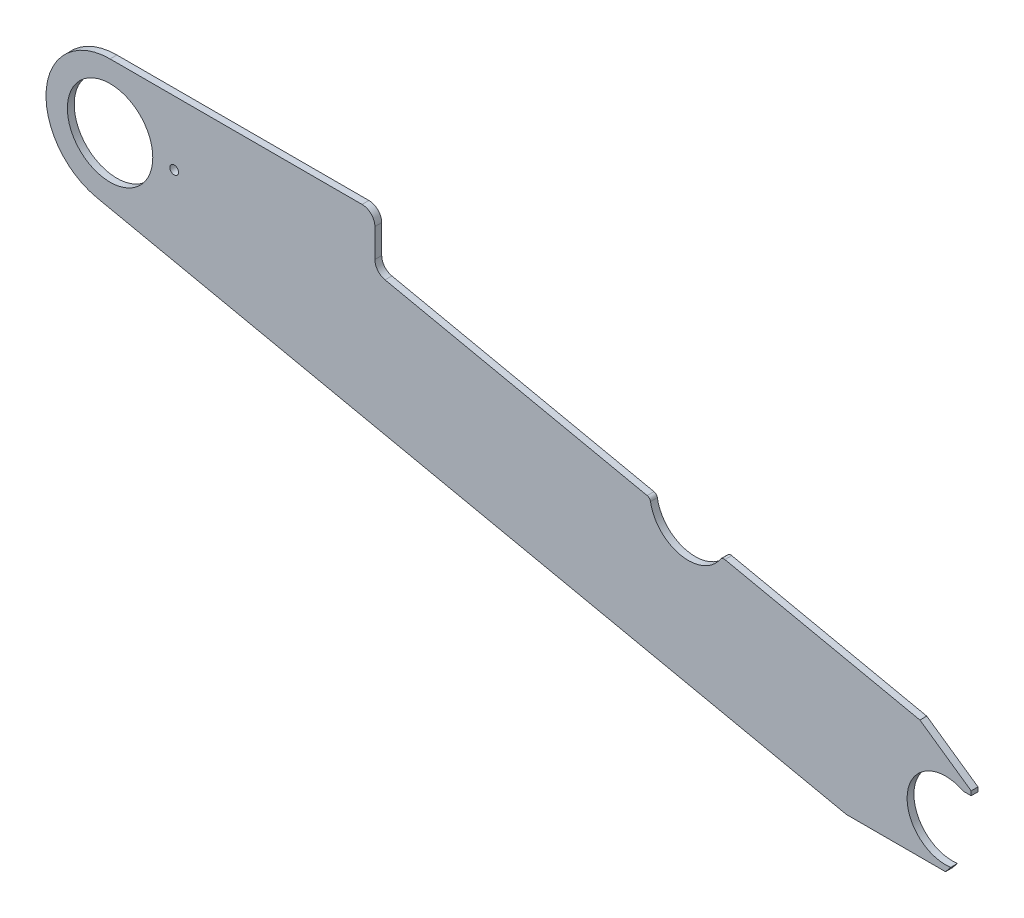
ISO-10303-21;
HEADER;
FILE_DESCRIPTION(('STEP AP214'),'2;1');
FILE_NAME('part.step','',(''),(''),'','','');
FILE_SCHEMA(('AUTOMOTIVE_DESIGN { 1 0 10303 214 1 1 1 1 }'));
ENDSEC;
DATA;
#1=APPLICATION_CONTEXT('core data for automotive mechanical design processes');
#2=APPLICATION_PROTOCOL_DEFINITION('international standard','automotive_design',2000,#1);
#3=PRODUCT_CONTEXT('',#1,'mechanical');
#4=PRODUCT('Part','Part','',(#3));
#5=PRODUCT_RELATED_PRODUCT_CATEGORY('part','',(#4));
#6=PRODUCT_DEFINITION_FORMATION('','',#4);
#7=PRODUCT_DEFINITION_CONTEXT('part definition',#1,'design');
#8=PRODUCT_DEFINITION('design','',#6,#7);
#9=PRODUCT_DEFINITION_SHAPE('','',#8);
#10=(LENGTH_UNIT() NAMED_UNIT(*) SI_UNIT(.MILLI.,.METRE.));
#11=(NAMED_UNIT(*) PLANE_ANGLE_UNIT() SI_UNIT($,.RADIAN.));
#12=(NAMED_UNIT(*) SI_UNIT($,.STERADIAN.) SOLID_ANGLE_UNIT());
#13=UNCERTAINTY_MEASURE_WITH_UNIT(LENGTH_MEASURE(1.E-05),#10,'distance_accuracy_value','');
#14=(GEOMETRIC_REPRESENTATION_CONTEXT(3) GLOBAL_UNCERTAINTY_ASSIGNED_CONTEXT((#13)) GLOBAL_UNIT_ASSIGNED_CONTEXT((#10,
#11,#12)) REPRESENTATION_CONTEXT('',''));
#15=CARTESIAN_POINT('',(0.,0.,0.));
#16=DIRECTION('',(0.,0.,1.));
#17=DIRECTION('',(1.,0.,0.));
#18=AXIS2_PLACEMENT_3D('',#15,#16,#17);
#19=CARTESIAN_POINT('',(977.999999999997,-208.000000000002,7.99999999999801));
#20=DIRECTION('',(0.,0.,1.00000000000001));
#21=DIRECTION('',(1.,0.,0.));
#22=AXIS2_PLACEMENT_3D('',#19,#20,#21);
#23=PLANE('',#22);
#24=CARTESIAN_POINT('',(75.0000000000002,0.,8.00000000000001));
#25=DIRECTION('',(0.,0.,1.00000000000001));
#26=DIRECTION('',(1.,0.,0.));
#27=AXIS2_PLACEMENT_3D('',#24,#25,#26);
#28=CIRCLE('',#27,5.09999999999999);
#29=CARTESIAN_POINT('',(80.1000000000002,0.,8.00000000000001));
#30=VERTEX_POINT('',#29);
#31=EDGE_CURVE('E314',#30,#30,#28,.T.);
#32=ORIENTED_EDGE('',*,*,#31,.F.);
#33=EDGE_LOOP('',(#32));
#34=FACE_BOUND('',#33,.T.);
#35=DIRECTION('',(-0.978123251294984,0.208026212954354,0.));
#36=VECTOR('',#35,1.);
#37=CARTESIAN_POINT('',(716.293570547808,-71.9320613168134,8.00000000000001));
#38=LINE('',#37,#36);
#39=CARTESIAN_POINT('',(947.999999999998,-121.211138337323,8.00000000000001));
#40=VERTEX_POINT('',#39);
#41=CARTESIAN_POINT('',(719.758987727906,-72.6690825575704,8.00000000000001));
#42=VERTEX_POINT('',#41);
#43=EDGE_CURVE('E220',#40,#42,#38,.T.);
#44=ORIENTED_EDGE('',*,*,#43,.T.);
#45=CARTESIAN_POINT('',(718.718856663133,-77.5596988140473,7.99999999999829));
#46=DIRECTION('',(0.,0.,1.00000000000001));
#47=DIRECTION('',(1.,0.,0.));
#48=AXIS2_PLACEMENT_3D('',#45,#46,#47);
#49=CIRCLE('',#48,5.);
#50=CARTESIAN_POINT('',(714.54697099682,-74.8037289326409,8.00000000000001));
#51=VERTEX_POINT('',#50);
#52=EDGE_CURVE('E44',#42,#51,#49,.T.);
#53=ORIENTED_EDGE('',*,*,#52,.T.);
#54=CARTESIAN_POINT('',(677.,-50.0000000000001,8.00000000000001));
#55=DIRECTION('',(0.,0.,-1.00000000000001));
#56=DIRECTION('',(1.,0.,0.));
#57=AXIS2_PLACEMENT_3D('',#54,#55,#56);
#58=CIRCLE('',#57,45.);
#59=CARTESIAN_POINT('',(632.608821060404,-57.3772103367567,8.00000000000001));
#60=VERTEX_POINT('',#59);
#61=EDGE_CURVE('E219',#51,#60,#58,.T.);
#62=ORIENTED_EDGE('',*,*,#61,.T.);
#63=CARTESIAN_POINT('',(627.676467844893,-58.1969003741741,8.00000000000001));
#64=DIRECTION('',(0.,0.,1.00000000000001));
#65=DIRECTION('',(1.,0.,0.));
#66=AXIS2_PLACEMENT_3D('',#63,#64,#65);
#67=CIRCLE('',#66,5.);
#68=CARTESIAN_POINT('',(628.716598909665,-53.3062841176992,7.99999999999995));
#69=VERTEX_POINT('',#68);
#70=EDGE_CURVE('E51',#60,#69,#67,.T.);
#71=ORIENTED_EDGE('',*,*,#70,.T.);
#72=DIRECTION('',(-0.978123251294984,0.208026212954354,0.));
#73=VECTOR('',#72,1.);
#74=CARTESIAN_POINT('',(310.,14.4780232168717,8.00000000000001));
#75=LINE('',#74,#73);
#76=CARTESIAN_POINT('',(321.879606805685,11.9514810741495,8.00000000000001));
#77=VERTEX_POINT('',#76);
#78=EDGE_CURVE('E228',#69,#77,#75,.T.);
#79=ORIENTED_EDGE('',*,*,#78,.T.);
#80=CARTESIAN_POINT('',(325.,26.6233298435742,8.00000000000001));
#81=DIRECTION('',(0.,0.,1.00000000000001));
#82=DIRECTION('',(1.,0.,0.));
#83=AXIS2_PLACEMENT_3D('',#80,#81,#82);
#84=CIRCLE('',#83,15.);
#85=CARTESIAN_POINT('',(310.,26.6233298435742,8.00000000000001));
#86=VERTEX_POINT('',#85);
#87=EDGE_CURVE('E205',#77,#86,#84,.F.);
#88=ORIENTED_EDGE('',*,*,#87,.T.);
#89=DIRECTION('',(0.,1.00000000000001,0.));
#90=VECTOR('',#89,1.);
#91=CARTESIAN_POINT('',(310.,75.0000000000006,8.00000000000001));
#92=LINE('',#91,#90);
#93=CARTESIAN_POINT('',(310.,60.0000000000002,8.00000000000001));
#94=VERTEX_POINT('',#93);
#95=EDGE_CURVE('E299',#86,#94,#92,.T.);
#96=ORIENTED_EDGE('',*,*,#95,.T.);
#97=CARTESIAN_POINT('',(295.,60.0000000000002,8.00000000000001));
#98=DIRECTION('',(0.,0.,1.00000000000001));
#99=DIRECTION('',(1.,0.,0.));
#100=AXIS2_PLACEMENT_3D('',#97,#98,#99);
#101=CIRCLE('',#100,15.);
#102=CARTESIAN_POINT('',(295.,75.0000000000006,8.00000000000001));
#103=VERTEX_POINT('',#102);
#104=EDGE_CURVE('E200',#94,#103,#101,.T.);
#105=ORIENTED_EDGE('',*,*,#104,.T.);
#106=DIRECTION('',(-1.,0.,0.));
#107=VECTOR('',#106,1.);
#108=CARTESIAN_POINT('',(0.,75.0000000000002,8.00000000000001));
#109=LINE('',#108,#107);
#110=CARTESIAN_POINT('',(0.,75.0000000000002,8.00000000000001));
#111=VERTEX_POINT('',#110);
#112=EDGE_CURVE('E297',#103,#111,#109,.T.);
#113=ORIENTED_EDGE('',*,*,#112,.T.);
#114=CARTESIAN_POINT('',(0.,0.,8.00000000000001));
#115=DIRECTION('',(0.,0.,1.00000000000001));
#116=DIRECTION('',(1.,0.,0.));
#117=AXIS2_PLACEMENT_3D('',#114,#115,#116);
#118=CIRCLE('',#117,75.);
#119=CARTESIAN_POINT('',(-15.6019659715763,-73.3592438471241,8.00000000000001));
#120=VERTEX_POINT('',#119);
#121=EDGE_CURVE('E295',#111,#120,#118,.T.);
#122=ORIENTED_EDGE('',*,*,#121,.T.);
#123=DIRECTION('',(0.978123251294984,-0.208026212954354,0.));
#124=VECTOR('',#123,1.);
#125=CARTESIAN_POINT('',(-15.6019659715763,-73.3592438471241,8.00000000000001));
#126=LINE('',#125,#124);
#127=CARTESIAN_POINT('',(861.968512478003,-260.000000000005,7.99999999999995));
#128=VERTEX_POINT('',#127);
#129=EDGE_CURVE('E293',#120,#128,#126,.T.);
#130=ORIENTED_EDGE('',*,*,#129,.T.);
#131=DIRECTION('',(1.,0.,0.));
#132=VECTOR('',#131,1.);
#133=CARTESIAN_POINT('',(977.999999999997,-260.000000000005,7.99999999999995));
#134=LINE('',#133,#132);
#135=CARTESIAN_POINT('',(977.999999999997,-260.000000000005,7.99999999999995));
#136=VERTEX_POINT('',#135);
#137=EDGE_CURVE('E291',#128,#136,#134,.T.);
#138=ORIENTED_EDGE('',*,*,#137,.T.);
#139=DIRECTION('',(0.629709857820889,0.776830415832966,0.));
#140=VECTOR('',#139,1.);
#141=CARTESIAN_POINT('',(977.999999999997,-260.000000000005,7.99999999999995));
#142=LINE('',#141,#140);
#143=CARTESIAN_POINT('',(983.999999999997,-252.59820624196,7.99999999999995));
#144=VERTEX_POINT('',#143);
#145=EDGE_CURVE('E173',#136,#144,#142,.T.);
#146=ORIENTED_EDGE('',*,*,#145,.T.);
#147=CARTESIAN_POINT('',(977.999999999997,-208.000000000002,7.99999999999801));
#148=DIRECTION('',(0.,0.,-1.00000000000001));
#149=DIRECTION('',(1.,0.,0.));
#150=AXIS2_PLACEMENT_3D('',#147,#148,#149);
#151=CIRCLE('',#150,45.);
#152=CARTESIAN_POINT('',(998.615528128088,-168.000000000002,8.00000000000001));
#153=VERTEX_POINT('',#152);
#154=EDGE_CURVE('E168',#144,#153,#151,.T.);
#155=ORIENTED_EDGE('',*,*,#154,.T.);
#156=DIRECTION('',(1.,0.,0.));
#157=VECTOR('',#156,1.);
#158=CARTESIAN_POINT('',(1008.,-168.000000000002,8.00000000000001));
#159=LINE('',#158,#157);
#160=CARTESIAN_POINT('',(1008.,-168.000000000002,8.00000000000001));
#161=VERTEX_POINT('',#160);
#162=EDGE_CURVE('E158',#153,#161,#159,.T.);
#163=ORIENTED_EDGE('',*,*,#162,.T.);
#164=DIRECTION('',(0.,1.00000000000001,0.));
#165=VECTOR('',#164,1.);
#166=CARTESIAN_POINT('',(1008.,-163.000000000002,7.99999999999995));
#167=LINE('',#166,#165);
#168=CARTESIAN_POINT('',(1008.,-163.000000000002,7.99999999999995));
#169=VERTEX_POINT('',#168);
#170=EDGE_CURVE('E167',#161,#169,#167,.T.);
#171=ORIENTED_EDGE('',*,*,#170,.T.);
#172=DIRECTION('',(-0.82058622831256,0.571522739620892,0.));
#173=VECTOR('',#172,1.);
#174=CARTESIAN_POINT('',(947.999999999998,-121.211138337323,8.00000000000001));
#175=LINE('',#174,#173);
#176=EDGE_CURVE('E282',#169,#40,#175,.T.);
#177=ORIENTED_EDGE('',*,*,#176,.T.);
#178=EDGE_LOOP('',(#44,#53,#62,#71,#79,#88,#96,#105,#113,#122,#130,#138,#146,#155,#163,#171,#177));
#179=FACE_BOUND('',#178,.T.);
#180=CARTESIAN_POINT('',(0.,0.,8.00000000000001));
#181=DIRECTION('',(0.,0.,1.00000000000001));
#182=DIRECTION('',(1.,0.,0.));
#183=AXIS2_PLACEMENT_3D('',#180,#181,#182);
#184=CIRCLE('',#183,50.);
#185=CARTESIAN_POINT('',(50.,0.,8.00000000000001));
#186=VERTEX_POINT('',#185);
#187=EDGE_CURVE('E289',#186,#186,#184,.T.);
#188=ORIENTED_EDGE('',*,*,#187,.F.);
#189=EDGE_LOOP('',(#188));
#190=FACE_BOUND('',#189,.T.);
#191=ADVANCED_FACE('F36',(#34,#179,#190),#23,.T.);
#192=CARTESIAN_POINT('',(977.999999999997,-208.000000000002,-1.99840144432528E-12));
#193=DIRECTION('',(0.,0.,1.00000000000001));
#194=DIRECTION('',(1.,0.,0.));
#195=AXIS2_PLACEMENT_3D('',#192,#193,#194);
#196=PLANE('',#195);
#197=CARTESIAN_POINT('',(75.0000000000002,0.,0.));
#198=DIRECTION('',(0.,0.,1.00000000000001));
#199=DIRECTION('',(1.,0.,0.));
#200=AXIS2_PLACEMENT_3D('',#197,#198,#199);
#201=CIRCLE('',#200,5.09999999999999);
#202=CARTESIAN_POINT('',(80.1000000000002,0.,0.));
#203=VERTEX_POINT('',#202);
#204=EDGE_CURVE('E309',#203,#203,#201,.T.);
#205=ORIENTED_EDGE('',*,*,#204,.T.);
#206=EDGE_LOOP('',(#205));
#207=FACE_BOUND('',#206,.T.);
#208=CARTESIAN_POINT('',(677.,-50.,0.));
#209=DIRECTION('',(0.,0.,-1.00000000000001));
#210=DIRECTION('',(1.,0.,0.));
#211=AXIS2_PLACEMENT_3D('',#208,#209,#210);
#212=CIRCLE('',#211,45.);
#213=CARTESIAN_POINT('',(714.54697099682,-74.8037289326408,0.));
#214=VERTEX_POINT('',#213);
#215=CARTESIAN_POINT('',(632.608821060404,-57.3772103367567,0.));
#216=VERTEX_POINT('',#215);
#217=EDGE_CURVE('E237',#214,#216,#212,.T.);
#218=ORIENTED_EDGE('',*,*,#217,.F.);
#219=CARTESIAN_POINT('',(718.718856663133,-77.5596988140473,-1.72084568816899E-12));
#220=DIRECTION('',(0.,0.,1.00000000000001));
#221=DIRECTION('',(1.,0.,0.));
#222=AXIS2_PLACEMENT_3D('',#219,#220,#221);
#223=CIRCLE('',#222,5.);
#224=CARTESIAN_POINT('',(719.758987727906,-72.6690825575703,0.));
#225=VERTEX_POINT('',#224);
#226=EDGE_CURVE('E214',#214,#225,#223,.F.);
#227=ORIENTED_EDGE('',*,*,#226,.T.);
#228=DIRECTION('',(-0.978123251294984,0.208026212954354,0.));
#229=VECTOR('',#228,1.);
#230=CARTESIAN_POINT('',(716.293570547808,-71.9320613168134,0.));
#231=LINE('',#230,#229);
#232=CARTESIAN_POINT('',(947.999999999998,-121.211138337323,0.));
#233=VERTEX_POINT('',#232);
#234=EDGE_CURVE('E236',#233,#225,#231,.T.);
#235=ORIENTED_EDGE('',*,*,#234,.F.);
#236=DIRECTION('',(-0.82058622831256,0.571522739620892,0.));
#237=VECTOR('',#236,1.);
#238=CARTESIAN_POINT('',(947.999999999998,-121.211138337323,0.));
#239=LINE('',#238,#237);
#240=CARTESIAN_POINT('',(1008.,-163.,0.));
#241=VERTEX_POINT('',#240);
#242=EDGE_CURVE('E242',#241,#233,#239,.T.);
#243=ORIENTED_EDGE('',*,*,#242,.F.);
#244=DIRECTION('',(0.,1.00000000000001,0.));
#245=VECTOR('',#244,1.);
#246=CARTESIAN_POINT('',(1008.,-163.,0.));
#247=LINE('',#246,#245);
#248=CARTESIAN_POINT('',(1008.,-168.,0.));
#249=VERTEX_POINT('',#248);
#250=EDGE_CURVE('E246',#249,#241,#247,.T.);
#251=ORIENTED_EDGE('',*,*,#250,.F.);
#252=DIRECTION('',(1.,0.,0.));
#253=VECTOR('',#252,1.);
#254=CARTESIAN_POINT('',(1008.,-168.,0.));
#255=LINE('',#254,#253);
#256=CARTESIAN_POINT('',(998.615528128088,-168.,0.));
#257=VERTEX_POINT('',#256);
#258=EDGE_CURVE('E285',#257,#249,#255,.T.);
#259=ORIENTED_EDGE('',*,*,#258,.F.);
#260=CARTESIAN_POINT('',(977.999999999997,-208.000000000002,-1.99840144432528E-12));
#261=DIRECTION('',(0.,0.,-1.00000000000001));
#262=DIRECTION('',(1.,0.,0.));
#263=AXIS2_PLACEMENT_3D('',#260,#261,#262);
#264=CIRCLE('',#263,45.);
#265=CARTESIAN_POINT('',(983.999999999997,-252.598206241958,0.));
#266=VERTEX_POINT('',#265);
#267=EDGE_CURVE('E181',#266,#257,#264,.T.);
#268=ORIENTED_EDGE('',*,*,#267,.F.);
#269=DIRECTION('',(0.629709857820889,0.776830415832966,0.));
#270=VECTOR('',#269,1.);
#271=CARTESIAN_POINT('',(977.999999999997,-260.000000000003,0.));
#272=LINE('',#271,#270);
#273=CARTESIAN_POINT('',(977.999999999997,-260.000000000003,0.));
#274=VERTEX_POINT('',#273);
#275=EDGE_CURVE('E177',#274,#266,#272,.T.);
#276=ORIENTED_EDGE('',*,*,#275,.F.);
#277=DIRECTION('',(1.,0.,0.));
#278=VECTOR('',#277,1.);
#279=CARTESIAN_POINT('',(977.999999999997,-260.000000000003,0.));
#280=LINE('',#279,#278);
#281=CARTESIAN_POINT('',(861.968512478003,-260.000000000003,0.));
#282=VERTEX_POINT('',#281);
#283=EDGE_CURVE('E260',#282,#274,#280,.T.);
#284=ORIENTED_EDGE('',*,*,#283,.F.);
#285=DIRECTION('',(0.978123251294984,-0.208026212954354,0.));
#286=VECTOR('',#285,1.);
#287=CARTESIAN_POINT('',(-15.6019659715763,-73.3592438471241,0.));
#288=LINE('',#287,#286);
#289=CARTESIAN_POINT('',(-15.6019659715763,-73.3592438471241,0.));
#290=VERTEX_POINT('',#289);
#291=EDGE_CURVE('E258',#290,#282,#288,.T.);
#292=ORIENTED_EDGE('',*,*,#291,.F.);
#293=CARTESIAN_POINT('',(0.,0.,0.));
#294=DIRECTION('',(0.,0.,1.00000000000001));
#295=DIRECTION('',(1.,0.,0.));
#296=AXIS2_PLACEMENT_3D('',#293,#294,#295);
#297=CIRCLE('',#296,75.);
#298=CARTESIAN_POINT('',(0.,75.0000000000002,0.));
#299=VERTEX_POINT('',#298);
#300=EDGE_CURVE('E256',#299,#290,#297,.T.);
#301=ORIENTED_EDGE('',*,*,#300,.F.);
#302=DIRECTION('',(-1.,0.,0.));
#303=VECTOR('',#302,1.);
#304=CARTESIAN_POINT('',(0.,75.0000000000002,0.));
#305=LINE('',#304,#303);
#306=CARTESIAN_POINT('',(295.,75.0000000000006,0.));
#307=VERTEX_POINT('',#306);
#308=EDGE_CURVE('E254',#307,#299,#305,.T.);
#309=ORIENTED_EDGE('',*,*,#308,.F.);
#310=CARTESIAN_POINT('',(295.,60.0000000000004,0.));
#311=DIRECTION('',(0.,0.,1.00000000000001));
#312=DIRECTION('',(1.,0.,0.));
#313=AXIS2_PLACEMENT_3D('',#310,#311,#312);
#314=CIRCLE('',#313,15.);
#315=CARTESIAN_POINT('',(310.,60.0000000000004,0.));
#316=VERTEX_POINT('',#315);
#317=EDGE_CURVE('E198',#307,#316,#314,.F.);
#318=ORIENTED_EDGE('',*,*,#317,.T.);
#319=DIRECTION('',(0.,1.00000000000001,0.));
#320=VECTOR('',#319,1.);
#321=CARTESIAN_POINT('',(310.,75.0000000000006,0.));
#322=LINE('',#321,#320);
#323=CARTESIAN_POINT('',(310.,26.6233298435745,0.));
#324=VERTEX_POINT('',#323);
#325=EDGE_CURVE('E251',#324,#316,#322,.T.);
#326=ORIENTED_EDGE('',*,*,#325,.F.);
#327=CARTESIAN_POINT('',(325.,26.6233298435745,0.));
#328=DIRECTION('',(0.,0.,1.00000000000001));
#329=DIRECTION('',(1.,0.,0.));
#330=AXIS2_PLACEMENT_3D('',#327,#328,#329);
#331=CIRCLE('',#330,15.);
#332=CARTESIAN_POINT('',(321.879606805685,11.9514810741495,0.));
#333=VERTEX_POINT('',#332);
#334=EDGE_CURVE('E202',#324,#333,#331,.T.);
#335=ORIENTED_EDGE('',*,*,#334,.T.);
#336=DIRECTION('',(-0.978123251294984,0.208026212954354,0.));
#337=VECTOR('',#336,1.);
#338=CARTESIAN_POINT('',(310.,14.4780232168717,0.));
#339=LINE('',#338,#337);
#340=CARTESIAN_POINT('',(628.716598909665,-53.3062841176992,0.));
#341=VERTEX_POINT('',#340);
#342=EDGE_CURVE('E244',#341,#333,#339,.T.);
#343=ORIENTED_EDGE('',*,*,#342,.F.);
#344=CARTESIAN_POINT('',(627.676467844893,-58.1969003741741,0.));
#345=DIRECTION('',(0.,0.,1.00000000000001));
#346=DIRECTION('',(1.,0.,0.));
#347=AXIS2_PLACEMENT_3D('',#344,#345,#346);
#348=CIRCLE('',#347,5.);
#349=EDGE_CURVE('E212',#341,#216,#348,.F.);
#350=ORIENTED_EDGE('',*,*,#349,.T.);
#351=EDGE_LOOP('',(#218,#227,#235,#243,#251,#259,#268,#276,#284,#292,#301,#309,#318,#326,#335,
#343,#350));
#352=FACE_BOUND('',#351,.T.);
#353=CARTESIAN_POINT('',(0.,0.,0.));
#354=DIRECTION('',(0.,0.,1.00000000000001));
#355=DIRECTION('',(1.,0.,0.));
#356=AXIS2_PLACEMENT_3D('',#353,#354,#355);
#357=CIRCLE('',#356,50.);
#358=CARTESIAN_POINT('',(50.,0.,0.));
#359=VERTEX_POINT('',#358);
#360=EDGE_CURVE('E306',#359,#359,#357,.T.);
#361=ORIENTED_EDGE('',*,*,#360,.T.);
#362=EDGE_LOOP('',(#361));
#363=FACE_BOUND('',#362,.T.);
#364=ADVANCED_FACE('F233',(#207,#352,#363),#196,.F.);
#365=CARTESIAN_POINT('',(977.999999999997,-208.000000000002,7.99999999999801));
#366=DIRECTION('',(0.,0.,-1.00000000000001));
#367=DIRECTION('',(-1.,0.,0.));
#368=AXIS2_PLACEMENT_3D('',#365,#366,#367);
#369=CYLINDRICAL_SURFACE('',#368,45.);
#370=ORIENTED_EDGE('',*,*,#267,.T.);
#371=DIRECTION('',(0.,0.,-1.00000000000001));
#372=VECTOR('',#371,1.);
#373=CARTESIAN_POINT('',(998.615528128088,-168.000000000002,8.00000000000001));
#374=LINE('',#373,#372);
#375=EDGE_CURVE('E162',#153,#257,#374,.T.);
#376=ORIENTED_EDGE('',*,*,#375,.F.);
#377=ORIENTED_EDGE('',*,*,#154,.F.);
#378=DIRECTION('',(0.,0.,-1.00000000000001));
#379=VECTOR('',#378,1.);
#380=CARTESIAN_POINT('',(983.999999999997,-252.59820624196,7.99999999999995));
#381=LINE('',#380,#379);
#382=EDGE_CURVE('E263',#144,#266,#381,.T.);
#383=ORIENTED_EDGE('',*,*,#382,.T.);
#384=EDGE_LOOP('',(#370,#376,#377,#383));
#385=FACE_BOUND('',#384,.T.);
#386=ADVANCED_FACE('F179',(#385),#369,.F.);
#387=CARTESIAN_POINT('',(1008.,-168.000000000002,8.00000000000001));
#388=DIRECTION('',(0.,1.00000000000001,0.));
#389=DIRECTION('',(0.,0.,1.00000000000001));
#390=AXIS2_PLACEMENT_3D('',#387,#388,#389);
#391=PLANE('',#390);
#392=ORIENTED_EDGE('',*,*,#258,.T.);
#393=DIRECTION('',(0.,0.,-1.00000000000001));
#394=VECTOR('',#393,1.);
#395=CARTESIAN_POINT('',(1008.,-168.000000000002,8.00000000000001));
#396=LINE('',#395,#394);
#397=EDGE_CURVE('E165',#161,#249,#396,.T.);
#398=ORIENTED_EDGE('',*,*,#397,.F.);
#399=ORIENTED_EDGE('',*,*,#162,.F.);
#400=ORIENTED_EDGE('',*,*,#375,.T.);
#401=EDGE_LOOP('',(#392,#398,#399,#400));
#402=FACE_BOUND('',#401,.T.);
#403=ADVANCED_FACE('F160',(#402),#391,.F.);
#404=CARTESIAN_POINT('',(1008.,-163.000000000002,7.99999999999995));
#405=DIRECTION('',(-1.,0.,0.));
#406=DIRECTION('',(0.,0.,1.00000000000001));
#407=AXIS2_PLACEMENT_3D('',#404,#405,#406);
#408=PLANE('',#407);
#409=ORIENTED_EDGE('',*,*,#250,.T.);
#410=DIRECTION('',(0.,0.,-1.00000000000001));
#411=VECTOR('',#410,1.);
#412=CARTESIAN_POINT('',(1008.,-163.000000000002,7.99999999999995));
#413=LINE('',#412,#411);
#414=EDGE_CURVE('E186',#169,#241,#413,.T.);
#415=ORIENTED_EDGE('',*,*,#414,.F.);
#416=ORIENTED_EDGE('',*,*,#170,.F.);
#417=ORIENTED_EDGE('',*,*,#397,.T.);
#418=EDGE_LOOP('',(#409,#415,#416,#417));
#419=FACE_BOUND('',#418,.T.);
#420=ADVANCED_FACE('F365',(#419),#408,.F.);
#421=CARTESIAN_POINT('',(947.999999999998,-121.211138337323,8.00000000000001));
#422=DIRECTION('',(-0.571522739620893,-0.820586228312573,0.));
#423=DIRECTION('',(0.82058622831256,-0.571522739620892,0.));
#424=AXIS2_PLACEMENT_3D('',#421,#422,#423);
#425=PLANE('',#424);
#426=ORIENTED_EDGE('',*,*,#242,.T.);
#427=DIRECTION('',(0.,0.,-1.00000000000001));
#428=VECTOR('',#427,1.);
#429=CARTESIAN_POINT('',(947.999999999998,-121.211138337323,8.00000000000001));
#430=LINE('',#429,#428);
#431=EDGE_CURVE('E241',#40,#233,#430,.T.);
#432=ORIENTED_EDGE('',*,*,#431,.F.);
#433=ORIENTED_EDGE('',*,*,#176,.F.);
#434=ORIENTED_EDGE('',*,*,#414,.T.);
#435=EDGE_LOOP('',(#426,#432,#433,#434));
#436=FACE_BOUND('',#435,.T.);
#437=ADVANCED_FACE('F281',(#436),#425,.F.);
#438=CARTESIAN_POINT('',(716.293570547808,-71.9320613168134,8.00000000000001));
#439=DIRECTION('',(-0.208026212954354,-0.978123251294996,0.));
#440=DIRECTION('',(0.978123251294984,-0.208026212954354,0.));
#441=AXIS2_PLACEMENT_3D('',#438,#439,#440);
#442=PLANE('',#441);
#443=ORIENTED_EDGE('',*,*,#234,.T.);
#444=DIRECTION('',(0.,0.,-1.00000000000001));
#445=VECTOR('',#444,1.);
#446=CARTESIAN_POINT('',(719.758987727906,-72.6690825575704,8.00000000000001));
#447=LINE('',#446,#445);
#448=EDGE_CURVE('E59',#225,#42,#447,.F.);
#449=ORIENTED_EDGE('',*,*,#448,.T.);
#450=ORIENTED_EDGE('',*,*,#43,.F.);
#451=ORIENTED_EDGE('',*,*,#431,.T.);
#452=EDGE_LOOP('',(#443,#449,#450,#451));
#453=FACE_BOUND('',#452,.T.);
#454=ADVANCED_FACE('F239',(#453),#442,.F.);
#455=CARTESIAN_POINT('',(677.,-50.0000000000001,8.00000000000001));
#456=DIRECTION('',(0.,0.,-1.00000000000001));
#457=DIRECTION('',(-1.,0.,0.));
#458=AXIS2_PLACEMENT_3D('',#455,#456,#457);
#459=CYLINDRICAL_SURFACE('',#458,45.);
#460=ORIENTED_EDGE('',*,*,#61,.F.);
#461=DIRECTION('',(0.,0.,-1.00000000000001));
#462=VECTOR('',#461,1.);
#463=CARTESIAN_POINT('',(714.54697099682,-74.8037289326409,8.00000000000001));
#464=LINE('',#463,#462);
#465=EDGE_CURVE('E209',#51,#214,#464,.T.);
#466=ORIENTED_EDGE('',*,*,#465,.T.);
#467=ORIENTED_EDGE('',*,*,#217,.T.);
#468=DIRECTION('',(0.,0.,-1.00000000000001));
#469=VECTOR('',#468,1.);
#470=CARTESIAN_POINT('',(632.608821060404,-57.3772103367567,8.00000000000001));
#471=LINE('',#470,#469);
#472=EDGE_CURVE('E207',#216,#60,#471,.F.);
#473=ORIENTED_EDGE('',*,*,#472,.T.);
#474=EDGE_LOOP('',(#460,#466,#467,#473));
#475=FACE_BOUND('',#474,.T.);
#476=ADVANCED_FACE('F224',(#475),#459,.F.);
#477=CARTESIAN_POINT('',(310.,14.4780232168717,8.00000000000001));
#478=DIRECTION('',(-0.208026212954354,-0.978123251294996,0.));
#479=DIRECTION('',(0.978123251294984,-0.208026212954354,0.));
#480=AXIS2_PLACEMENT_3D('',#477,#478,#479);
#481=PLANE('',#480);
#482=ORIENTED_EDGE('',*,*,#78,.F.);
#483=DIRECTION('',(0.,0.,-1.00000000000001));
#484=VECTOR('',#483,1.);
#485=CARTESIAN_POINT('',(628.716598909665,-53.3062841176992,7.99999999999995));
#486=LINE('',#485,#484);
#487=EDGE_CURVE('E11',#69,#341,#486,.T.);
#488=ORIENTED_EDGE('',*,*,#487,.T.);
#489=ORIENTED_EDGE('',*,*,#342,.T.);
#490=DIRECTION('',(0.,0.,-1.00000000000001));
#491=VECTOR('',#490,1.);
#492=CARTESIAN_POINT('',(321.879606805685,11.9514810741495,8.00000000000001));
#493=LINE('',#492,#491);
#494=EDGE_CURVE('E192',#333,#77,#493,.F.);
#495=ORIENTED_EDGE('',*,*,#494,.T.);
#496=EDGE_LOOP('',(#482,#488,#489,#495));
#497=FACE_BOUND('',#496,.T.);
#498=ADVANCED_FACE('F354',(#497),#481,.F.);
#499=CARTESIAN_POINT('',(310.,75.0000000000006,8.00000000000001));
#500=DIRECTION('',(-1.,0.,0.));
#501=DIRECTION('',(0.,0.,1.00000000000001));
#502=AXIS2_PLACEMENT_3D('',#499,#500,#501);
#503=PLANE('',#502);
#504=ORIENTED_EDGE('',*,*,#95,.F.);
#505=DIRECTION('',(0.,0.,-1.00000000000001));
#506=VECTOR('',#505,1.);
#507=CARTESIAN_POINT('',(310.,26.6233298435745,0.));
#508=LINE('',#507,#506);
#509=EDGE_CURVE('E184',#86,#324,#508,.T.);
#510=ORIENTED_EDGE('',*,*,#509,.T.);
#511=ORIENTED_EDGE('',*,*,#325,.T.);
#512=DIRECTION('',(0.,0.,-1.00000000000001));
#513=VECTOR('',#512,1.);
#514=CARTESIAN_POINT('',(310.,60.0000000000002,8.00000000000001));
#515=LINE('',#514,#513);
#516=EDGE_CURVE('E182',#316,#94,#515,.F.);
#517=ORIENTED_EDGE('',*,*,#516,.T.);
#518=EDGE_LOOP('',(#504,#510,#511,#517));
#519=FACE_BOUND('',#518,.T.);
#520=ADVANCED_FACE('F350',(#519),#503,.F.);
#521=CARTESIAN_POINT('',(0.,75.0000000000002,8.00000000000001));
#522=DIRECTION('',(0.,-1.00000000000001,0.));
#523=DIRECTION('',(1.,0.,0.));
#524=AXIS2_PLACEMENT_3D('',#521,#522,#523);
#525=PLANE('',#524);
#526=ORIENTED_EDGE('',*,*,#112,.F.);
#527=DIRECTION('',(0.,0.,-1.00000000000001));
#528=VECTOR('',#527,1.);
#529=CARTESIAN_POINT('',(295.,75.0000000000006,8.00000000000001));
#530=LINE('',#529,#528);
#531=EDGE_CURVE('E195',#103,#307,#530,.T.);
#532=ORIENTED_EDGE('',*,*,#531,.T.);
#533=ORIENTED_EDGE('',*,*,#308,.T.);
#534=DIRECTION('',(0.,0.,-1.00000000000001));
#535=VECTOR('',#534,1.);
#536=CARTESIAN_POINT('',(0.,75.0000000000002,8.00000000000001));
#537=LINE('',#536,#535);
#538=EDGE_CURVE('E274',#111,#299,#537,.T.);
#539=ORIENTED_EDGE('',*,*,#538,.F.);
#540=EDGE_LOOP('',(#526,#532,#533,#539));
#541=FACE_BOUND('',#540,.T.);
#542=ADVANCED_FACE('F346',(#541),#525,.F.);
#543=CARTESIAN_POINT('',(0.,0.,8.00000000000001));
#544=DIRECTION('',(0.,0.,-1.00000000000001));
#545=DIRECTION('',(-1.,0.,0.));
#546=AXIS2_PLACEMENT_3D('',#543,#544,#545);
#547=CYLINDRICAL_SURFACE('',#546,75.);
#548=ORIENTED_EDGE('',*,*,#300,.T.);
#549=DIRECTION('',(0.,0.,-1.00000000000001));
#550=VECTOR('',#549,1.);
#551=CARTESIAN_POINT('',(-15.6019659715763,-73.3592438471241,8.00000000000001));
#552=LINE('',#551,#550);
#553=EDGE_CURVE('E271',#120,#290,#552,.T.);
#554=ORIENTED_EDGE('',*,*,#553,.F.);
#555=ORIENTED_EDGE('',*,*,#121,.F.);
#556=ORIENTED_EDGE('',*,*,#538,.T.);
#557=EDGE_LOOP('',(#548,#554,#555,#556));
#558=FACE_BOUND('',#557,.T.);
#559=ADVANCED_FACE('F342',(#558),#547,.T.);
#560=CARTESIAN_POINT('',(-15.6019659715763,-73.3592438471241,8.00000000000001));
#561=DIRECTION('',(0.208026212954354,0.978123251294996,0.));
#562=DIRECTION('',(-0.978123251294984,0.208026212954354,0.));
#563=AXIS2_PLACEMENT_3D('',#560,#561,#562);
#564=PLANE('',#563);
#565=ORIENTED_EDGE('',*,*,#291,.T.);
#566=DIRECTION('',(0.,0.,-1.00000000000001));
#567=VECTOR('',#566,1.);
#568=CARTESIAN_POINT('',(861.968512478003,-260.000000000005,7.99999999999995));
#569=LINE('',#568,#567);
#570=EDGE_CURVE('E268',#128,#282,#569,.T.);
#571=ORIENTED_EDGE('',*,*,#570,.F.);
#572=ORIENTED_EDGE('',*,*,#129,.F.);
#573=ORIENTED_EDGE('',*,*,#553,.T.);
#574=EDGE_LOOP('',(#565,#571,#572,#573));
#575=FACE_BOUND('',#574,.T.);
#576=ADVANCED_FACE('F338',(#575),#564,.F.);
#577=CARTESIAN_POINT('',(977.999999999997,-260.000000000005,7.99999999999995));
#578=DIRECTION('',(0.,1.00000000000001,0.));
#579=DIRECTION('',(0.,0.,1.00000000000001));
#580=AXIS2_PLACEMENT_3D('',#577,#578,#579);
#581=PLANE('',#580);
#582=ORIENTED_EDGE('',*,*,#283,.T.);
#583=DIRECTION('',(0.,0.,-1.00000000000001));
#584=VECTOR('',#583,1.);
#585=CARTESIAN_POINT('',(977.999999999997,-260.000000000005,7.99999999999995));
#586=LINE('',#585,#584);
#587=EDGE_CURVE('E265',#136,#274,#586,.T.);
#588=ORIENTED_EDGE('',*,*,#587,.F.);
#589=ORIENTED_EDGE('',*,*,#137,.F.);
#590=ORIENTED_EDGE('',*,*,#570,.T.);
#591=EDGE_LOOP('',(#582,#588,#589,#590));
#592=FACE_BOUND('',#591,.T.);
#593=ADVANCED_FACE('F334',(#592),#581,.F.);
#594=CARTESIAN_POINT('',(977.999999999997,-260.000000000005,7.99999999999995));
#595=DIRECTION('',(-0.776830415832954,0.629709857820889,0.));
#596=DIRECTION('',(-0.629709857820889,-0.776830415832966,0.));
#597=AXIS2_PLACEMENT_3D('',#594,#595,#596);
#598=PLANE('',#597);
#599=ORIENTED_EDGE('',*,*,#275,.T.);
#600=ORIENTED_EDGE('',*,*,#382,.F.);
#601=ORIENTED_EDGE('',*,*,#145,.F.);
#602=ORIENTED_EDGE('',*,*,#587,.T.);
#603=EDGE_LOOP('',(#599,#600,#601,#602));
#604=FACE_BOUND('',#603,.T.);
#605=ADVANCED_FACE('F331',(#604),#598,.F.);
#606=CARTESIAN_POINT('',(0.,0.,8.00000000000001));
#607=DIRECTION('',(0.,0.,-1.00000000000001));
#608=DIRECTION('',(-1.,0.,0.));
#609=AXIS2_PLACEMENT_3D('',#606,#607,#608);
#610=CYLINDRICAL_SURFACE('',#609,50.);
#611=ORIENTED_EDGE('',*,*,#187,.T.);
#612=EDGE_LOOP('',(#611));
#613=FACE_BOUND('',#612,.T.);
#614=ORIENTED_EDGE('',*,*,#360,.F.);
#615=EDGE_LOOP('',(#614));
#616=FACE_BOUND('',#615,.T.);
#617=ADVANCED_FACE('F328',(#613,#616),#610,.F.);
#618=CARTESIAN_POINT('',(325.,26.6233298435742,8.00000000000001));
#619=DIRECTION('',(0.,0.,1.00000000000001));
#620=DIRECTION('',(1.,0.,0.));
#621=AXIS2_PLACEMENT_3D('',#618,#619,#620);
#622=CYLINDRICAL_SURFACE('',#621,15.);
#623=ORIENTED_EDGE('',*,*,#87,.F.);
#624=ORIENTED_EDGE('',*,*,#494,.F.);
#625=ORIENTED_EDGE('',*,*,#334,.F.);
#626=ORIENTED_EDGE('',*,*,#509,.F.);
#627=EDGE_LOOP('',(#623,#624,#625,#626));
#628=FACE_BOUND('',#627,.T.);
#629=ADVANCED_FACE('F372',(#628),#622,.F.);
#630=CARTESIAN_POINT('',(295.,60.0000000000002,8.00000000000001));
#631=DIRECTION('',(0.,0.,-1.00000000000001));
#632=DIRECTION('',(-1.,0.,0.));
#633=AXIS2_PLACEMENT_3D('',#630,#631,#632);
#634=CYLINDRICAL_SURFACE('',#633,15.);
#635=ORIENTED_EDGE('',*,*,#104,.F.);
#636=ORIENTED_EDGE('',*,*,#516,.F.);
#637=ORIENTED_EDGE('',*,*,#317,.F.);
#638=ORIENTED_EDGE('',*,*,#531,.F.);
#639=EDGE_LOOP('',(#635,#636,#637,#638));
#640=FACE_BOUND('',#639,.T.);
#641=ADVANCED_FACE('F375',(#640),#634,.T.);
#642=CARTESIAN_POINT('',(75.0000000000002,0.,8.00000000000001));
#643=DIRECTION('',(0.,0.,1.00000000000001));
#644=DIRECTION('',(1.,0.,0.));
#645=AXIS2_PLACEMENT_3D('',#642,#643,#644);
#646=CYLINDRICAL_SURFACE('',#645,5.09999999999999);
#647=ORIENTED_EDGE('',*,*,#204,.F.);
#648=EDGE_LOOP('',(#647));
#649=FACE_BOUND('',#648,.T.);
#650=ORIENTED_EDGE('',*,*,#31,.T.);
#651=EDGE_LOOP('',(#650));
#652=FACE_BOUND('',#651,.T.);
#653=ADVANCED_FACE('F318',(#649,#652),#646,.F.);
#654=CARTESIAN_POINT('',(718.718856663133,-77.5596988140473,7.99999999999829));
#655=DIRECTION('',(0.,0.,-1.00000000000001));
#656=DIRECTION('',(-1.,0.,0.));
#657=AXIS2_PLACEMENT_3D('',#654,#655,#656);
#658=CYLINDRICAL_SURFACE('',#657,5.);
#659=ORIENTED_EDGE('',*,*,#52,.F.);
#660=ORIENTED_EDGE('',*,*,#448,.F.);
#661=ORIENTED_EDGE('',*,*,#226,.F.);
#662=ORIENTED_EDGE('',*,*,#465,.F.);
#663=EDGE_LOOP('',(#659,#660,#661,#662));
#664=FACE_BOUND('',#663,.T.);
#665=ADVANCED_FACE('F230',(#664),#658,.T.);
#666=CARTESIAN_POINT('',(627.676467844893,-58.1969003741741,8.00000000000001));
#667=DIRECTION('',(0.,0.,-1.00000000000001));
#668=DIRECTION('',(-1.,0.,0.));
#669=AXIS2_PLACEMENT_3D('',#666,#667,#668);
#670=CYLINDRICAL_SURFACE('',#669,5.);
#671=ORIENTED_EDGE('',*,*,#70,.F.);
#672=ORIENTED_EDGE('',*,*,#472,.F.);
#673=ORIENTED_EDGE('',*,*,#349,.F.);
#674=ORIENTED_EDGE('',*,*,#487,.F.);
#675=EDGE_LOOP('',(#671,#672,#673,#674));
#676=FACE_BOUND('',#675,.T.);
#677=ADVANCED_FACE('F38',(#676),#670,.T.);
#678=CLOSED_SHELL('',(#191,#364,#386,#403,#420,#437,#454,#476,#498,#520,#542,#559,#576,#593,
#605,#617,#629,#641,#653,#665,#677));
#679=MANIFOLD_SOLID_BREP('B2',#678);
#680=ADVANCED_BREP_SHAPE_REPRESENTATION('',(#18,#679),#14);
#681=SHAPE_DEFINITION_REPRESENTATION(#9,#680);
ENDSEC;
END-ISO-10303-21;
